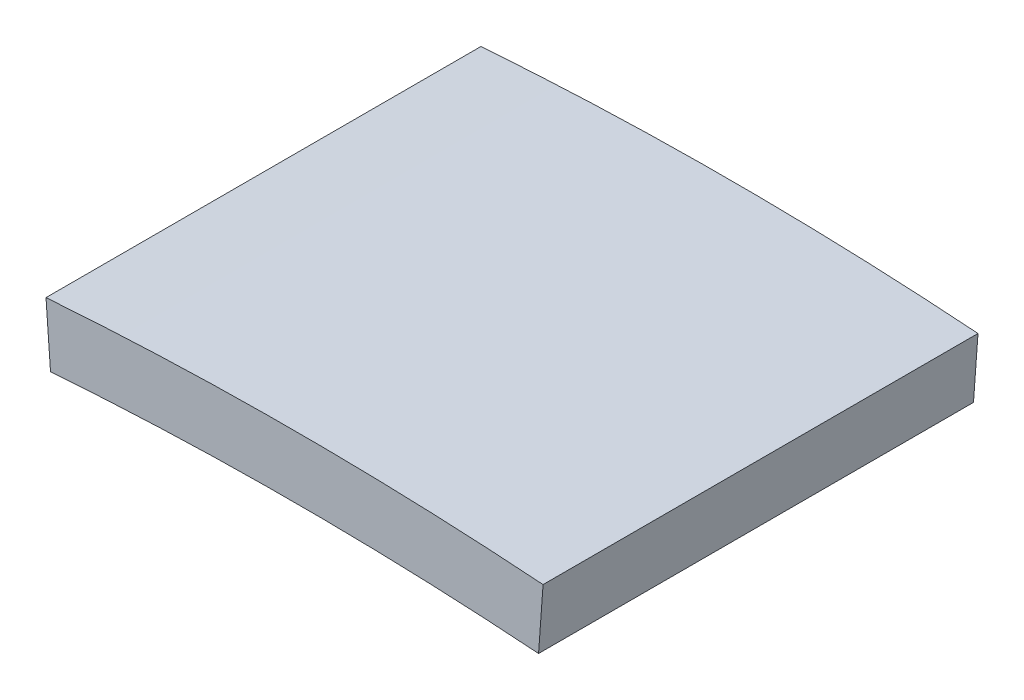
ISO-10303-21;
HEADER;
FILE_DESCRIPTION(('STEP AP214'),'2;1');
FILE_NAME('part.step','',(''),(''),'','','');
FILE_SCHEMA(('AUTOMOTIVE_DESIGN { 1 0 10303 214 1 1 1 1 }'));
ENDSEC;
DATA;
#1=APPLICATION_CONTEXT('core data for automotive mechanical design processes');
#2=APPLICATION_PROTOCOL_DEFINITION('international standard','automotive_design',2000,#1);
#3=PRODUCT_CONTEXT('',#1,'mechanical');
#4=PRODUCT('Part','Part','',(#3));
#5=PRODUCT_RELATED_PRODUCT_CATEGORY('part','',(#4));
#6=PRODUCT_DEFINITION_FORMATION('','',#4);
#7=PRODUCT_DEFINITION_CONTEXT('part definition',#1,'design');
#8=PRODUCT_DEFINITION('design','',#6,#7);
#9=PRODUCT_DEFINITION_SHAPE('','',#8);
#10=(LENGTH_UNIT() NAMED_UNIT(*) SI_UNIT(.MILLI.,.METRE.));
#11=(NAMED_UNIT(*) PLANE_ANGLE_UNIT() SI_UNIT($,.RADIAN.));
#12=(NAMED_UNIT(*) SI_UNIT($,.STERADIAN.) SOLID_ANGLE_UNIT());
#13=UNCERTAINTY_MEASURE_WITH_UNIT(LENGTH_MEASURE(1.E-05),#10,'distance_accuracy_value','');
#14=(GEOMETRIC_REPRESENTATION_CONTEXT(3) GLOBAL_UNCERTAINTY_ASSIGNED_CONTEXT((#13)) GLOBAL_UNIT_ASSIGNED_CONTEXT((#10,
#11,#12)) REPRESENTATION_CONTEXT('',''));
#15=CARTESIAN_POINT('',(0.,0.,0.));
#16=DIRECTION('',(0.,0.,1.));
#17=DIRECTION('',(1.,0.,0.));
#18=AXIS2_PLACEMENT_3D('',#15,#16,#17);
#19=CARTESIAN_POINT('',(0.,0.,70.));
#20=DIRECTION('',(0.,0.,-1.));
#21=DIRECTION('',(-1.,0.,0.));
#22=AXIS2_PLACEMENT_3D('',#19,#20,#21);
#23=CYLINDRICAL_SURFACE('',#22,551.);
#24=CARTESIAN_POINT('',(0.,0.,0.));
#25=DIRECTION('',(0.,0.,1.));
#26=DIRECTION('',(1.,0.,0.));
#27=AXIS2_PLACEMENT_3D('',#24,#25,#26);
#28=CIRCLE('',#27,551.);
#29=CARTESIAN_POINT('',(40.,549.546176403767,0.));
#30=VERTEX_POINT('',#29);
#31=CARTESIAN_POINT('',(-39.9999999999999,549.546176403767,0.));
#32=VERTEX_POINT('',#31);
#33=EDGE_CURVE('E101',#30,#32,#28,.T.);
#34=ORIENTED_EDGE('',*,*,#33,.T.);
#35=DIRECTION('',(0.,0.,-1.));
#36=VECTOR('',#35,1.);
#37=CARTESIAN_POINT('',(-39.9999999999999,549.546176403767,70.));
#38=LINE('',#37,#36);
#39=CARTESIAN_POINT('',(-39.9999999999999,549.546176403767,70.));
#40=VERTEX_POINT('',#39);
#41=EDGE_CURVE('E11',#40,#32,#38,.T.);
#42=ORIENTED_EDGE('',*,*,#41,.F.);
#43=CARTESIAN_POINT('',(0.,0.,70.));
#44=DIRECTION('',(0.,0.,1.));
#45=DIRECTION('',(1.,0.,0.));
#46=AXIS2_PLACEMENT_3D('',#43,#44,#45);
#47=CIRCLE('',#46,551.);
#48=CARTESIAN_POINT('',(40.,549.546176403767,70.));
#49=VERTEX_POINT('',#48);
#50=EDGE_CURVE('E78',#49,#40,#47,.T.);
#51=ORIENTED_EDGE('',*,*,#50,.F.);
#52=DIRECTION('',(0.,0.,-1.));
#53=VECTOR('',#52,1.);
#54=CARTESIAN_POINT('',(40.,549.546176403767,70.));
#55=LINE('',#54,#53);
#56=EDGE_CURVE('E54',#49,#30,#55,.T.);
#57=ORIENTED_EDGE('',*,*,#56,.T.);
#58=EDGE_LOOP('',(#34,#42,#51,#57));
#59=FACE_BOUND('',#58,.T.);
#60=ADVANCED_FACE('F38',(#59),#23,.T.);
#61=CARTESIAN_POINT('',(-39.2740471869328,539.572561587001,70.));
#62=DIRECTION('',(-0.997361481676528,-0.072595281306715,0.));
#63=DIRECTION('',(0.072595281306715,-0.997361481676528,0.));
#64=AXIS2_PLACEMENT_3D('',#61,#62,#63);
#65=PLANE('',#64);
#66=DIRECTION('',(-0.072595281306715,0.997361481676528,0.));
#67=VECTOR('',#66,1.);
#68=CARTESIAN_POINT('',(-39.2740471869328,539.572561587001,0.));
#69=LINE('',#68,#67);
#70=CARTESIAN_POINT('',(-39.2740471869328,539.572561587001,0.));
#71=VERTEX_POINT('',#70);
#72=EDGE_CURVE('E87',#71,#32,#69,.T.);
#73=ORIENTED_EDGE('',*,*,#72,.F.);
#74=DIRECTION('',(0.,0.,-1.));
#75=VECTOR('',#74,1.);
#76=CARTESIAN_POINT('',(-39.2740471869328,539.572561587001,70.));
#77=LINE('',#76,#75);
#78=CARTESIAN_POINT('',(-39.2740471869328,539.572561587001,70.));
#79=VERTEX_POINT('',#78);
#80=EDGE_CURVE('E46',#79,#71,#77,.T.);
#81=ORIENTED_EDGE('',*,*,#80,.F.);
#82=DIRECTION('',(-0.072595281306715,0.997361481676528,0.));
#83=VECTOR('',#82,1.);
#84=CARTESIAN_POINT('',(-39.2740471869328,539.572561587001,70.));
#85=LINE('',#84,#83);
#86=EDGE_CURVE('E85',#79,#40,#85,.T.);
#87=ORIENTED_EDGE('',*,*,#86,.T.);
#88=ORIENTED_EDGE('',*,*,#41,.T.);
#89=EDGE_LOOP('',(#73,#81,#87,#88));
#90=FACE_BOUND('',#89,.T.);
#91=ADVANCED_FACE('F84',(#90),#65,.T.);
#92=CARTESIAN_POINT('',(0.,0.,70.));
#93=DIRECTION('',(0.,0.,-1.));
#94=DIRECTION('',(-1.,0.,0.));
#95=AXIS2_PLACEMENT_3D('',#92,#93,#94);
#96=CYLINDRICAL_SURFACE('',#95,541.);
#97=CARTESIAN_POINT('',(0.,0.,0.));
#98=DIRECTION('',(0.,0.,1.));
#99=DIRECTION('',(1.,0.,0.));
#100=AXIS2_PLACEMENT_3D('',#97,#98,#99);
#101=CIRCLE('',#100,541.);
#102=CARTESIAN_POINT('',(39.2740471869329,539.572561587001,0.));
#103=VERTEX_POINT('',#102);
#104=EDGE_CURVE('E104',#103,#71,#101,.T.);
#105=ORIENTED_EDGE('',*,*,#104,.F.);
#106=DIRECTION('',(0.,0.,-1.));
#107=VECTOR('',#106,1.);
#108=CARTESIAN_POINT('',(39.2740471869329,539.572561587001,70.));
#109=LINE('',#108,#107);
#110=CARTESIAN_POINT('',(39.2740471869329,539.572561587001,70.));
#111=VERTEX_POINT('',#110);
#112=EDGE_CURVE('E67',#111,#103,#109,.T.);
#113=ORIENTED_EDGE('',*,*,#112,.F.);
#114=CARTESIAN_POINT('',(0.,0.,70.));
#115=DIRECTION('',(0.,0.,1.));
#116=DIRECTION('',(1.,0.,0.));
#117=AXIS2_PLACEMENT_3D('',#114,#115,#116);
#118=CIRCLE('',#117,541.);
#119=EDGE_CURVE('E93',#111,#79,#118,.T.);
#120=ORIENTED_EDGE('',*,*,#119,.T.);
#121=ORIENTED_EDGE('',*,*,#80,.T.);
#122=EDGE_LOOP('',(#105,#113,#120,#121));
#123=FACE_BOUND('',#122,.T.);
#124=ADVANCED_FACE('F95',(#123),#96,.F.);
#125=CARTESIAN_POINT('',(40.,549.546176403767,70.));
#126=DIRECTION('',(0.997361481676528,-0.072595281306715,0.));
#127=DIRECTION('',(0.072595281306715,0.997361481676528,0.));
#128=AXIS2_PLACEMENT_3D('',#125,#126,#127);
#129=PLANE('',#128);
#130=DIRECTION('',(-0.072595281306715,-0.997361481676528,0.));
#131=VECTOR('',#130,1.);
#132=CARTESIAN_POINT('',(40.,549.546176403767,0.));
#133=LINE('',#132,#131);
#134=EDGE_CURVE('E106',#30,#103,#133,.T.);
#135=ORIENTED_EDGE('',*,*,#134,.F.);
#136=ORIENTED_EDGE('',*,*,#56,.F.);
#137=DIRECTION('',(-0.072595281306715,-0.997361481676528,0.));
#138=VECTOR('',#137,1.);
#139=CARTESIAN_POINT('',(40.,549.546176403767,70.));
#140=LINE('',#139,#138);
#141=EDGE_CURVE('E96',#49,#111,#140,.T.);
#142=ORIENTED_EDGE('',*,*,#141,.T.);
#143=ORIENTED_EDGE('',*,*,#112,.T.);
#144=EDGE_LOOP('',(#135,#136,#142,#143));
#145=FACE_BOUND('',#144,.T.);
#146=ADVANCED_FACE('F112',(#145),#129,.T.);
#147=CARTESIAN_POINT('',(0.,0.,70.));
#148=DIRECTION('',(0.,0.,1.));
#149=DIRECTION('',(1.,0.,0.));
#150=AXIS2_PLACEMENT_3D('',#147,#148,#149);
#151=PLANE('',#150);
#152=ORIENTED_EDGE('',*,*,#50,.T.);
#153=ORIENTED_EDGE('',*,*,#86,.F.);
#154=ORIENTED_EDGE('',*,*,#119,.F.);
#155=ORIENTED_EDGE('',*,*,#141,.F.);
#156=EDGE_LOOP('',(#152,#153,#154,#155));
#157=FACE_BOUND('',#156,.T.);
#158=ADVANCED_FACE('F92',(#157),#151,.T.);
#159=CARTESIAN_POINT('',(0.,0.,0.));
#160=DIRECTION('',(0.,0.,1.));
#161=DIRECTION('',(1.,0.,0.));
#162=AXIS2_PLACEMENT_3D('',#159,#160,#161);
#163=PLANE('',#162);
#164=ORIENTED_EDGE('',*,*,#33,.F.);
#165=ORIENTED_EDGE('',*,*,#134,.T.);
#166=ORIENTED_EDGE('',*,*,#104,.T.);
#167=ORIENTED_EDGE('',*,*,#72,.T.);
#168=EDGE_LOOP('',(#164,#165,#166,#167));
#169=FACE_BOUND('',#168,.T.);
#170=ADVANCED_FACE('F111',(#169),#163,.F.);
#171=CLOSED_SHELL('',(#60,#91,#124,#146,#158,#170));
#172=MANIFOLD_SOLID_BREP('B2',#171);
#173=ADVANCED_BREP_SHAPE_REPRESENTATION('',(#18,#172),#14);
#174=SHAPE_DEFINITION_REPRESENTATION(#9,#173);
ENDSEC;
END-ISO-10303-21;
